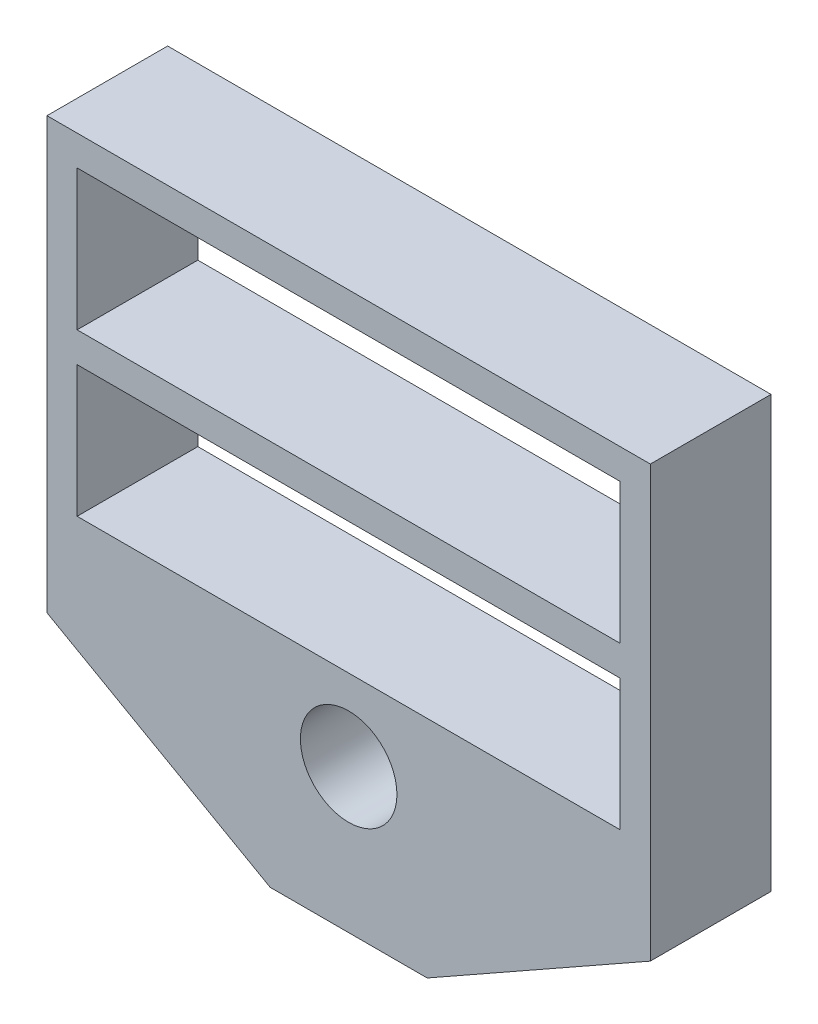
ISO-10303-21;
HEADER;
FILE_DESCRIPTION(('STEP AP214'),'2;1');
FILE_NAME('part.step','',(''),(''),'','','');
FILE_SCHEMA(('AUTOMOTIVE_DESIGN { 1 0 10303 214 1 1 1 1 }'));
ENDSEC;
DATA;
#1=APPLICATION_CONTEXT('core data for automotive mechanical design processes');
#2=APPLICATION_PROTOCOL_DEFINITION('international standard','automotive_design',2000,#1);
#3=PRODUCT_CONTEXT('',#1,'mechanical');
#4=PRODUCT('Part','Part','',(#3));
#5=PRODUCT_RELATED_PRODUCT_CATEGORY('part','',(#4));
#6=PRODUCT_DEFINITION_FORMATION('','',#4);
#7=PRODUCT_DEFINITION_CONTEXT('part definition',#1,'design');
#8=PRODUCT_DEFINITION('design','',#6,#7);
#9=PRODUCT_DEFINITION_SHAPE('','',#8);
#10=(LENGTH_UNIT() NAMED_UNIT(*) SI_UNIT(.MILLI.,.METRE.));
#11=(NAMED_UNIT(*) PLANE_ANGLE_UNIT() SI_UNIT($,.RADIAN.));
#12=(NAMED_UNIT(*) SI_UNIT($,.STERADIAN.) SOLID_ANGLE_UNIT());
#13=UNCERTAINTY_MEASURE_WITH_UNIT(LENGTH_MEASURE(1.E-05),#10,'distance_accuracy_value','');
#14=(GEOMETRIC_REPRESENTATION_CONTEXT(3) GLOBAL_UNCERTAINTY_ASSIGNED_CONTEXT((#13)) GLOBAL_UNIT_ASSIGNED_CONTEXT((#10,
#11,#12)) REPRESENTATION_CONTEXT('',''));
#15=CARTESIAN_POINT('',(0.,0.,0.));
#16=DIRECTION('',(0.,0.,1.));
#17=DIRECTION('',(1.,0.,0.));
#18=AXIS2_PLACEMENT_3D('',#15,#16,#17);
#19=CARTESIAN_POINT('',(-45.,0.,-10.));
#20=DIRECTION('',(1.,0.,0.));
#21=DIRECTION('',(0.,0.,-1.));
#22=AXIS2_PLACEMENT_3D('',#19,#20,#21);
#23=PLANE('',#22);
#24=DIRECTION('',(0.,1.,0.));
#25=VECTOR('',#24,1.);
#26=CARTESIAN_POINT('',(-45.,0.,-10.));
#27=LINE('',#26,#25);
#28=CARTESIAN_POINT('',(-45.,13.4322142937052,-10.));
#29=VERTEX_POINT('',#28);
#30=CARTESIAN_POINT('',(-45.,35.1948730291194,-10.));
#31=VERTEX_POINT('',#30);
#32=EDGE_CURVE('E121',#29,#31,#27,.T.);
#33=ORIENTED_EDGE('',*,*,#32,.T.);
#34=DIRECTION('',(0.,0.,-1.));
#35=VECTOR('',#34,1.);
#36=CARTESIAN_POINT('',(-45.,35.1948730291194,0.));
#37=LINE('',#36,#35);
#38=CARTESIAN_POINT('',(-45.,35.1948730291194,10.));
#39=VERTEX_POINT('',#38);
#40=EDGE_CURVE('E209',#39,#31,#37,.T.);
#41=ORIENTED_EDGE('',*,*,#40,.F.);
#42=DIRECTION('',(0.,1.,0.));
#43=VECTOR('',#42,1.);
#44=CARTESIAN_POINT('',(-45.,0.,10.));
#45=LINE('',#44,#43);
#46=CARTESIAN_POINT('',(-45.,13.4322142937052,10.));
#47=VERTEX_POINT('',#46);
#48=EDGE_CURVE('E364',#47,#39,#45,.T.);
#49=ORIENTED_EDGE('',*,*,#48,.F.);
#50=DIRECTION('',(0.,0.,1.));
#51=VECTOR('',#50,1.);
#52=CARTESIAN_POINT('',(-45.,13.4322142937052,-10.));
#53=LINE('',#52,#51);
#54=EDGE_CURVE('E246',#29,#47,#53,.T.);
#55=ORIENTED_EDGE('',*,*,#54,.F.);
#56=EDGE_LOOP('',(#33,#41,#49,#55));
#57=FACE_BOUND('',#56,.T.);
#58=ADVANCED_FACE('F97',(#57),#23,.T.);
#59=CARTESIAN_POINT('',(45.,0.,-10.));
#60=DIRECTION('',(1.,0.,0.));
#61=DIRECTION('',(0.,0.,-1.));
#62=AXIS2_PLACEMENT_3D('',#59,#60,#61);
#63=PLANE('',#62);
#64=DIRECTION('',(0.,0.,1.));
#65=VECTOR('',#64,1.);
#66=CARTESIAN_POINT('',(45.,35.1948730291194,0.));
#67=LINE('',#66,#65);
#68=CARTESIAN_POINT('',(45.,35.1948730291194,-10.));
#69=VERTEX_POINT('',#68);
#70=CARTESIAN_POINT('',(45.,35.1948730291194,10.));
#71=VERTEX_POINT('',#70);
#72=EDGE_CURVE('E220',#69,#71,#67,.T.);
#73=ORIENTED_EDGE('',*,*,#72,.F.);
#74=DIRECTION('',(0.,1.,0.));
#75=VECTOR('',#74,1.);
#76=CARTESIAN_POINT('',(45.,0.,-10.));
#77=LINE('',#76,#75);
#78=CARTESIAN_POINT('',(45.,13.4322142937052,-10.));
#79=VERTEX_POINT('',#78);
#80=EDGE_CURVE('E227',#79,#69,#77,.T.);
#81=ORIENTED_EDGE('',*,*,#80,.F.);
#82=DIRECTION('',(0.,0.,1.));
#83=VECTOR('',#82,1.);
#84=CARTESIAN_POINT('',(45.,13.4322142937052,-10.));
#85=LINE('',#84,#83);
#86=CARTESIAN_POINT('',(45.,13.4322142937052,10.));
#87=VERTEX_POINT('',#86);
#88=EDGE_CURVE('E233',#79,#87,#85,.T.);
#89=ORIENTED_EDGE('',*,*,#88,.T.);
#90=DIRECTION('',(0.,1.,0.));
#91=VECTOR('',#90,1.);
#92=CARTESIAN_POINT('',(45.,0.,10.));
#93=LINE('',#92,#91);
#94=EDGE_CURVE('E351',#87,#71,#93,.T.);
#95=ORIENTED_EDGE('',*,*,#94,.T.);
#96=EDGE_LOOP('',(#73,#81,#89,#95));
#97=FACE_BOUND('',#96,.T.);
#98=ADVANCED_FACE('F395',(#97),#63,.F.);
#99=CARTESIAN_POINT('',(0.,13.4322142937052,10.));
#100=DIRECTION('',(0.,-1.,0.));
#101=DIRECTION('',(0.,0.,-1.));
#102=AXIS2_PLACEMENT_3D('',#99,#100,#101);
#103=PLANE('',#102);
#104=DIRECTION('',(-1.,0.,0.));
#105=VECTOR('',#104,1.);
#106=CARTESIAN_POINT('',(0.,13.4322142937052,-10.));
#107=LINE('',#106,#105);
#108=EDGE_CURVE('E265',#79,#29,#107,.T.);
#109=ORIENTED_EDGE('',*,*,#108,.T.);
#110=ORIENTED_EDGE('',*,*,#54,.T.);
#111=DIRECTION('',(-1.,0.,0.));
#112=VECTOR('',#111,1.);
#113=CARTESIAN_POINT('',(0.,13.4322142937052,10.));
#114=LINE('',#113,#112);
#115=EDGE_CURVE('E291',#87,#47,#114,.T.);
#116=ORIENTED_EDGE('',*,*,#115,.F.);
#117=ORIENTED_EDGE('',*,*,#88,.F.);
#118=EDGE_LOOP('',(#109,#110,#116,#117));
#119=FACE_BOUND('',#118,.T.);
#120=ADVANCED_FACE('F391',(#119),#103,.F.);
#121=CARTESIAN_POINT('',(50.,0.,10.));
#122=DIRECTION('',(1.,0.,0.));
#123=DIRECTION('',(0.,1.,0.));
#124=AXIS2_PLACEMENT_3D('',#121,#122,#123);
#125=PLANE('',#124);
#126=DIRECTION('',(0.,-1.,0.));
#127=VECTOR('',#126,1.);
#128=CARTESIAN_POINT('',(50.,0.,10.));
#129=LINE('',#128,#127);
#130=CARTESIAN_POINT('',(50.,68.4322142937052,10.));
#131=VERTEX_POINT('',#130);
#132=CARTESIAN_POINT('',(50.,-2.91671614465819,10.));
#133=VERTEX_POINT('',#132);
#134=EDGE_CURVE('E288',#131,#133,#129,.T.);
#135=ORIENTED_EDGE('',*,*,#134,.T.);
#136=DIRECTION('',(0.,0.,-1.));
#137=VECTOR('',#136,1.);
#138=CARTESIAN_POINT('',(50.,-2.91671614465819,10.));
#139=LINE('',#138,#137);
#140=CARTESIAN_POINT('',(50.,-2.91671614465819,-10.));
#141=VERTEX_POINT('',#140);
#142=EDGE_CURVE('E312',#133,#141,#139,.T.);
#143=ORIENTED_EDGE('',*,*,#142,.T.);
#144=DIRECTION('',(0.,-1.,0.));
#145=VECTOR('',#144,1.);
#146=CARTESIAN_POINT('',(50.,0.,-10.));
#147=LINE('',#146,#145);
#148=CARTESIAN_POINT('',(50.,68.4322142937052,-10.));
#149=VERTEX_POINT('',#148);
#150=EDGE_CURVE('E262',#149,#141,#147,.T.);
#151=ORIENTED_EDGE('',*,*,#150,.F.);
#152=DIRECTION('',(0.,0.,1.));
#153=VECTOR('',#152,1.);
#154=CARTESIAN_POINT('',(50.,68.4322142937052,-10.));
#155=LINE('',#154,#153);
#156=EDGE_CURVE('E254',#149,#131,#155,.T.);
#157=ORIENTED_EDGE('',*,*,#156,.T.);
#158=EDGE_LOOP('',(#135,#143,#151,#157));
#159=FACE_BOUND('',#158,.T.);
#160=ADVANCED_FACE('F99',(#159),#125,.T.);
#161=CARTESIAN_POINT('',(-50.,0.,10.));
#162=DIRECTION('',(1.,0.,0.));
#163=DIRECTION('',(0.,1.,0.));
#164=AXIS2_PLACEMENT_3D('',#161,#162,#163);
#165=PLANE('',#164);
#166=DIRECTION('',(0.,-1.,0.));
#167=VECTOR('',#166,1.);
#168=CARTESIAN_POINT('',(-50.,0.,-10.));
#169=LINE('',#168,#167);
#170=CARTESIAN_POINT('',(-50.,68.4322142937052,-10.));
#171=VERTEX_POINT('',#170);
#172=CARTESIAN_POINT('',(-50.,-2.9167161446582,-10.));
#173=VERTEX_POINT('',#172);
#174=EDGE_CURVE('E269',#171,#173,#169,.T.);
#175=ORIENTED_EDGE('',*,*,#174,.T.);
#176=DIRECTION('',(0.,0.,-1.));
#177=VECTOR('',#176,1.);
#178=CARTESIAN_POINT('',(-50.,-2.9167161446582,10.));
#179=LINE('',#178,#177);
#180=CARTESIAN_POINT('',(-50.,-2.9167161446582,10.));
#181=VERTEX_POINT('',#180);
#182=EDGE_CURVE('E12',#181,#173,#179,.T.);
#183=ORIENTED_EDGE('',*,*,#182,.F.);
#184=DIRECTION('',(0.,-1.,0.));
#185=VECTOR('',#184,1.);
#186=CARTESIAN_POINT('',(-50.,0.,10.));
#187=LINE('',#186,#185);
#188=CARTESIAN_POINT('',(-50.,68.4322142937052,10.));
#189=VERTEX_POINT('',#188);
#190=EDGE_CURVE('E295',#189,#181,#187,.T.);
#191=ORIENTED_EDGE('',*,*,#190,.F.);
#192=DIRECTION('',(0.,0.,1.));
#193=VECTOR('',#192,1.);
#194=CARTESIAN_POINT('',(-50.,68.4322142937052,-10.));
#195=LINE('',#194,#193);
#196=EDGE_CURVE('E258',#171,#189,#195,.T.);
#197=ORIENTED_EDGE('',*,*,#196,.F.);
#198=EDGE_LOOP('',(#175,#183,#191,#197));
#199=FACE_BOUND('',#198,.T.);
#200=ADVANCED_FACE('F333',(#199),#165,.F.);
#201=CARTESIAN_POINT('',(-13.3634834694245,-23.6330799713918,10.));
#202=DIRECTION('',(0.492215125545242,0.870473589596193,0.));
#203=DIRECTION('',(-0.870473589596193,0.492215125545242,0.));
#204=AXIS2_PLACEMENT_3D('',#201,#202,#203);
#205=PLANE('',#204);
#206=ORIENTED_EDGE('',*,*,#182,.T.);
#207=DIRECTION('',(0.870473589596193,-0.492215125545242,0.));
#208=VECTOR('',#207,1.);
#209=CARTESIAN_POINT('',(-13.3634834694245,-23.6330799713918,-10.));
#210=LINE('',#209,#208);
#211=CARTESIAN_POINT('',(-13.0139644497253,-23.8307178437154,-10.));
#212=VERTEX_POINT('',#211);
#213=EDGE_CURVE('E272',#173,#212,#210,.T.);
#214=ORIENTED_EDGE('',*,*,#213,.T.);
#215=DIRECTION('',(0.,0.,-1.));
#216=VECTOR('',#215,1.);
#217=CARTESIAN_POINT('',(-13.0139644497253,-23.8307178437154,10.));
#218=LINE('',#217,#216);
#219=CARTESIAN_POINT('',(-13.0139644497253,-23.8307178437154,10.));
#220=VERTEX_POINT('',#219);
#221=EDGE_CURVE('E106',#220,#212,#218,.T.);
#222=ORIENTED_EDGE('',*,*,#221,.F.);
#223=DIRECTION('',(0.870473589596193,-0.492215125545242,0.));
#224=VECTOR('',#223,1.);
#225=CARTESIAN_POINT('',(-13.3634834694245,-23.6330799713918,10.));
#226=LINE('',#225,#224);
#227=EDGE_CURVE('E298',#181,#220,#226,.T.);
#228=ORIENTED_EDGE('',*,*,#227,.F.);
#229=EDGE_LOOP('',(#206,#214,#222,#228));
#230=FACE_BOUND('',#229,.T.);
#231=ADVANCED_FACE('F330',(#230),#205,.F.);
#232=CARTESIAN_POINT('',(0.,-23.8307178437154,10.));
#233=DIRECTION('',(0.,1.,0.));
#234=DIRECTION('',(0.,0.,1.));
#235=AXIS2_PLACEMENT_3D('',#232,#233,#234);
#236=PLANE('',#235);
#237=ORIENTED_EDGE('',*,*,#221,.T.);
#238=DIRECTION('',(1.,0.,0.));
#239=VECTOR('',#238,1.);
#240=CARTESIAN_POINT('',(0.,-23.8307178437154,-10.));
#241=LINE('',#240,#239);
#242=CARTESIAN_POINT('',(13.0139644497255,-23.8307178437154,-10.));
#243=VERTEX_POINT('',#242);
#244=EDGE_CURVE('E276',#212,#243,#241,.T.);
#245=ORIENTED_EDGE('',*,*,#244,.T.);
#246=DIRECTION('',(0.,0.,-1.));
#247=VECTOR('',#246,1.);
#248=CARTESIAN_POINT('',(13.0139644497255,-23.8307178437154,10.));
#249=LINE('',#248,#247);
#250=CARTESIAN_POINT('',(13.0139644497255,-23.8307178437154,10.));
#251=VERTEX_POINT('',#250);
#252=EDGE_CURVE('E316',#251,#243,#249,.T.);
#253=ORIENTED_EDGE('',*,*,#252,.F.);
#254=DIRECTION('',(1.,0.,0.));
#255=VECTOR('',#254,1.);
#256=CARTESIAN_POINT('',(0.,-23.8307178437154,10.));
#257=LINE('',#256,#255);
#258=EDGE_CURVE('E301',#220,#251,#257,.T.);
#259=ORIENTED_EDGE('',*,*,#258,.F.);
#260=EDGE_LOOP('',(#237,#245,#253,#259));
#261=FACE_BOUND('',#260,.T.);
#262=ADVANCED_FACE('F323',(#261),#236,.F.);
#263=CARTESIAN_POINT('',(13.3634834694246,-23.6330799713918,10.));
#264=DIRECTION('',(0.492215125545244,-0.870473589596192,0.));
#265=DIRECTION('',(0.870473589596192,0.492215125545244,0.));
#266=AXIS2_PLACEMENT_3D('',#263,#264,#265);
#267=PLANE('',#266);
#268=ORIENTED_EDGE('',*,*,#252,.T.);
#269=DIRECTION('',(-0.870473589596192,-0.492215125545244,0.));
#270=VECTOR('',#269,1.);
#271=CARTESIAN_POINT('',(13.3634834694246,-23.6330799713918,-10.));
#272=LINE('',#271,#270);
#273=EDGE_CURVE('E280',#141,#243,#272,.T.);
#274=ORIENTED_EDGE('',*,*,#273,.F.);
#275=ORIENTED_EDGE('',*,*,#142,.F.);
#276=DIRECTION('',(-0.870473589596192,-0.492215125545244,0.));
#277=VECTOR('',#276,1.);
#278=CARTESIAN_POINT('',(13.3634834694246,-23.6330799713918,10.));
#279=LINE('',#278,#277);
#280=EDGE_CURVE('E304',#133,#251,#279,.T.);
#281=ORIENTED_EDGE('',*,*,#280,.T.);
#282=EDGE_LOOP('',(#268,#274,#275,#281));
#283=FACE_BOUND('',#282,.T.);
#284=ADVANCED_FACE('F346',(#283),#267,.T.);
#285=CARTESIAN_POINT('',(0.,0.,10.));
#286=DIRECTION('',(0.,0.,-1.));
#287=DIRECTION('',(-1.,0.,0.));
#288=AXIS2_PLACEMENT_3D('',#285,#286,#287);
#289=CYLINDRICAL_SURFACE('',#288,8.);
#290=CARTESIAN_POINT('',(0.,0.,10.));
#291=DIRECTION('',(0.,0.,1.));
#292=DIRECTION('',(1.,0.,0.));
#293=AXIS2_PLACEMENT_3D('',#290,#291,#292);
#294=CIRCLE('',#293,8.);
#295=CARTESIAN_POINT('',(8.,0.,10.));
#296=VERTEX_POINT('',#295);
#297=EDGE_CURVE('E308',#296,#296,#294,.T.);
#298=ORIENTED_EDGE('',*,*,#297,.T.);
#299=EDGE_LOOP('',(#298));
#300=FACE_BOUND('',#299,.T.);
#301=CARTESIAN_POINT('',(0.,0.,-10.));
#302=DIRECTION('',(0.,0.,1.));
#303=DIRECTION('',(1.,0.,0.));
#304=AXIS2_PLACEMENT_3D('',#301,#302,#303);
#305=CIRCLE('',#304,8.);
#306=CARTESIAN_POINT('',(8.,0.,-10.));
#307=VERTEX_POINT('',#306);
#308=EDGE_CURVE('E284',#307,#307,#305,.T.);
#309=ORIENTED_EDGE('',*,*,#308,.F.);
#310=EDGE_LOOP('',(#309));
#311=FACE_BOUND('',#310,.T.);
#312=ADVANCED_FACE('F424',(#300,#311),#289,.F.);
#313=CARTESIAN_POINT('',(0.,0.,10.));
#314=DIRECTION('',(0.,0.,1.));
#315=DIRECTION('',(1.,0.,0.));
#316=AXIS2_PLACEMENT_3D('',#313,#314,#315);
#317=PLANE('',#316);
#318=ORIENTED_EDGE('',*,*,#48,.T.);
#319=DIRECTION('',(1.,0.,0.));
#320=VECTOR('',#319,1.);
#321=CARTESIAN_POINT('',(-65.6155281280883,35.1948730291194,10.));
#322=LINE('',#321,#320);
#323=EDGE_CURVE('E371',#39,#71,#322,.T.);
#324=ORIENTED_EDGE('',*,*,#323,.T.);
#325=ORIENTED_EDGE('',*,*,#94,.F.);
#326=ORIENTED_EDGE('',*,*,#115,.T.);
#327=EDGE_LOOP('',(#318,#324,#325,#326));
#328=FACE_BOUND('',#327,.T.);
#329=DIRECTION('',(1.,0.,0.));
#330=VECTOR('',#329,1.);
#331=CARTESIAN_POINT('',(0.,68.4322142937052,10.));
#332=LINE('',#331,#330);
#333=EDGE_CURVE('E341',#189,#131,#332,.T.);
#334=ORIENTED_EDGE('',*,*,#333,.F.);
#335=ORIENTED_EDGE('',*,*,#190,.T.);
#336=ORIENTED_EDGE('',*,*,#227,.T.);
#337=ORIENTED_EDGE('',*,*,#258,.T.);
#338=ORIENTED_EDGE('',*,*,#280,.F.);
#339=ORIENTED_EDGE('',*,*,#134,.F.);
#340=EDGE_LOOP('',(#334,#335,#336,#337,#338,#339));
#341=FACE_BOUND('',#340,.T.);
#342=DIRECTION('',(1.,0.,0.));
#343=VECTOR('',#342,1.);
#344=CARTESIAN_POINT('',(-65.6155281280883,40.1948730291195,10.));
#345=LINE('',#344,#343);
#346=CARTESIAN_POINT('',(-45.,40.1948730291195,10.));
#347=VERTEX_POINT('',#346);
#348=CARTESIAN_POINT('',(45.,40.1948730291195,10.));
#349=VERTEX_POINT('',#348);
#350=EDGE_CURVE('E216',#347,#349,#345,.T.);
#351=ORIENTED_EDGE('',*,*,#350,.F.);
#352=CARTESIAN_POINT('',(-45.,63.4322142937052,10.));
#353=VERTEX_POINT('',#352);
#354=EDGE_CURVE('E367',#347,#353,#45,.T.);
#355=ORIENTED_EDGE('',*,*,#354,.T.);
#356=DIRECTION('',(1.,0.,0.));
#357=VECTOR('',#356,1.);
#358=CARTESIAN_POINT('',(0.,63.4322142937052,10.));
#359=LINE('',#358,#357);
#360=CARTESIAN_POINT('',(45.,63.4322142937052,10.));
#361=VERTEX_POINT('',#360);
#362=EDGE_CURVE('E360',#353,#361,#359,.T.);
#363=ORIENTED_EDGE('',*,*,#362,.T.);
#364=EDGE_CURVE('E356',#349,#361,#93,.T.);
#365=ORIENTED_EDGE('',*,*,#364,.F.);
#366=EDGE_LOOP('',(#351,#355,#363,#365));
#367=FACE_BOUND('',#366,.T.);
#368=ORIENTED_EDGE('',*,*,#297,.F.);
#369=EDGE_LOOP('',(#368));
#370=FACE_BOUND('',#369,.T.);
#371=ADVANCED_FACE('F348',(#328,#341,#367,#370),#317,.T.);
#372=CARTESIAN_POINT('',(0.,0.,-10.));
#373=DIRECTION('',(0.,0.,1.));
#374=DIRECTION('',(1.,0.,0.));
#375=AXIS2_PLACEMENT_3D('',#372,#373,#374);
#376=PLANE('',#375);
#377=CARTESIAN_POINT('',(-45.,40.1948730291195,-10.));
#378=VERTEX_POINT('',#377);
#379=CARTESIAN_POINT('',(-45.,63.4322142937052,-10.));
#380=VERTEX_POINT('',#379);
#381=EDGE_CURVE('E206',#378,#380,#27,.T.);
#382=ORIENTED_EDGE('',*,*,#381,.F.);
#383=DIRECTION('',(1.,0.,0.));
#384=VECTOR('',#383,1.);
#385=CARTESIAN_POINT('',(-65.6155281280883,40.1948730291195,-10.));
#386=LINE('',#385,#384);
#387=CARTESIAN_POINT('',(45.,40.1948730291195,-10.));
#388=VERTEX_POINT('',#387);
#389=EDGE_CURVE('E198',#378,#388,#386,.T.);
#390=ORIENTED_EDGE('',*,*,#389,.T.);
#391=CARTESIAN_POINT('',(45.,63.4322142937052,-10.));
#392=VERTEX_POINT('',#391);
#393=EDGE_CURVE('E204',#388,#392,#77,.T.);
#394=ORIENTED_EDGE('',*,*,#393,.T.);
#395=DIRECTION('',(1.,0.,0.));
#396=VECTOR('',#395,1.);
#397=CARTESIAN_POINT('',(0.,63.4322142937052,-10.));
#398=LINE('',#397,#396);
#399=EDGE_CURVE('E228',#380,#392,#398,.T.);
#400=ORIENTED_EDGE('',*,*,#399,.F.);
#401=EDGE_LOOP('',(#382,#390,#394,#400));
#402=FACE_BOUND('',#401,.T.);
#403=ORIENTED_EDGE('',*,*,#174,.F.);
#404=DIRECTION('',(1.,0.,0.));
#405=VECTOR('',#404,1.);
#406=CARTESIAN_POINT('',(0.,68.4322142937052,-10.));
#407=LINE('',#406,#405);
#408=EDGE_CURVE('E250',#171,#149,#407,.T.);
#409=ORIENTED_EDGE('',*,*,#408,.T.);
#410=ORIENTED_EDGE('',*,*,#150,.T.);
#411=ORIENTED_EDGE('',*,*,#273,.T.);
#412=ORIENTED_EDGE('',*,*,#244,.F.);
#413=ORIENTED_EDGE('',*,*,#213,.F.);
#414=EDGE_LOOP('',(#403,#409,#410,#411,#412,#413));
#415=FACE_BOUND('',#414,.T.);
#416=ORIENTED_EDGE('',*,*,#32,.F.);
#417=ORIENTED_EDGE('',*,*,#108,.F.);
#418=ORIENTED_EDGE('',*,*,#80,.T.);
#419=DIRECTION('',(1.,0.,0.));
#420=VECTOR('',#419,1.);
#421=CARTESIAN_POINT('',(-65.6155281280883,35.1948730291194,-10.));
#422=LINE('',#421,#420);
#423=EDGE_CURVE('E210',#31,#69,#422,.T.);
#424=ORIENTED_EDGE('',*,*,#423,.F.);
#425=EDGE_LOOP('',(#416,#417,#418,#424));
#426=FACE_BOUND('',#425,.T.);
#427=ORIENTED_EDGE('',*,*,#308,.T.);
#428=EDGE_LOOP('',(#427));
#429=FACE_BOUND('',#428,.T.);
#430=ADVANCED_FACE('F200',(#402,#415,#426,#429),#376,.F.);
#431=CARTESIAN_POINT('',(0.,68.4322142937052,-10.));
#432=DIRECTION('',(0.,-1.,0.));
#433=DIRECTION('',(0.,0.,-1.));
#434=AXIS2_PLACEMENT_3D('',#431,#432,#433);
#435=PLANE('',#434);
#436=ORIENTED_EDGE('',*,*,#196,.T.);
#437=ORIENTED_EDGE('',*,*,#333,.T.);
#438=ORIENTED_EDGE('',*,*,#156,.F.);
#439=ORIENTED_EDGE('',*,*,#408,.F.);
#440=EDGE_LOOP('',(#436,#437,#438,#439));
#441=FACE_BOUND('',#440,.T.);
#442=ADVANCED_FACE('F339',(#441),#435,.F.);
#443=DIRECTION('',(0.,0.,-1.));
#444=VECTOR('',#443,1.);
#445=CARTESIAN_POINT('',(-45.,40.1948730291195,0.));
#446=LINE('',#445,#444);
#447=EDGE_CURVE('E113',#347,#378,#446,.T.);
#448=ORIENTED_EDGE('',*,*,#447,.T.);
#449=ORIENTED_EDGE('',*,*,#381,.T.);
#450=DIRECTION('',(0.,0.,1.));
#451=VECTOR('',#450,1.);
#452=CARTESIAN_POINT('',(-45.,63.4322142937052,-10.));
#453=LINE('',#452,#451);
#454=EDGE_CURVE('E242',#380,#353,#453,.T.);
#455=ORIENTED_EDGE('',*,*,#454,.T.);
#456=ORIENTED_EDGE('',*,*,#354,.F.);
#457=EDGE_LOOP('',(#448,#449,#455,#456));
#458=FACE_BOUND('',#457,.T.);
#459=ADVANCED_FACE('F404',(#458),#23,.T.);
#460=CARTESIAN_POINT('',(0.,63.4322142937052,-10.));
#461=DIRECTION('',(0.,-1.,0.));
#462=DIRECTION('',(0.,0.,-1.));
#463=AXIS2_PLACEMENT_3D('',#460,#461,#462);
#464=PLANE('',#463);
#465=DIRECTION('',(0.,0.,1.));
#466=VECTOR('',#465,1.);
#467=CARTESIAN_POINT('',(45.,63.4322142937052,-10.));
#468=LINE('',#467,#466);
#469=EDGE_CURVE('E224',#392,#361,#468,.T.);
#470=ORIENTED_EDGE('',*,*,#469,.T.);
#471=ORIENTED_EDGE('',*,*,#362,.F.);
#472=ORIENTED_EDGE('',*,*,#454,.F.);
#473=ORIENTED_EDGE('',*,*,#399,.T.);
#474=EDGE_LOOP('',(#470,#471,#472,#473));
#475=FACE_BOUND('',#474,.T.);
#476=ADVANCED_FACE('F408',(#475),#464,.T.);
#477=ORIENTED_EDGE('',*,*,#393,.F.);
#478=DIRECTION('',(0.,0.,1.));
#479=VECTOR('',#478,1.);
#480=CARTESIAN_POINT('',(45.,40.1948730291195,0.));
#481=LINE('',#480,#479);
#482=EDGE_CURVE('E213',#388,#349,#481,.T.);
#483=ORIENTED_EDGE('',*,*,#482,.T.);
#484=ORIENTED_EDGE('',*,*,#364,.T.);
#485=ORIENTED_EDGE('',*,*,#469,.F.);
#486=EDGE_LOOP('',(#477,#483,#484,#485));
#487=FACE_BOUND('',#486,.T.);
#488=ADVANCED_FACE('F222',(#487),#63,.F.);
#489=CARTESIAN_POINT('',(-65.6155281280883,35.1948730291194,0.));
#490=DIRECTION('',(0.,1.,0.));
#491=DIRECTION('',(0.,0.,1.));
#492=AXIS2_PLACEMENT_3D('',#489,#490,#491);
#493=PLANE('',#492);
#494=ORIENTED_EDGE('',*,*,#323,.F.);
#495=ORIENTED_EDGE('',*,*,#40,.T.);
#496=ORIENTED_EDGE('',*,*,#423,.T.);
#497=ORIENTED_EDGE('',*,*,#72,.T.);
#498=EDGE_LOOP('',(#494,#495,#496,#497));
#499=FACE_BOUND('',#498,.T.);
#500=ADVANCED_FACE('F385',(#499),#493,.F.);
#501=CARTESIAN_POINT('',(-65.6155281280883,40.1948730291195,0.));
#502=DIRECTION('',(0.,1.,0.));
#503=DIRECTION('',(0.,0.,1.));
#504=AXIS2_PLACEMENT_3D('',#501,#502,#503);
#505=PLANE('',#504);
#506=ORIENTED_EDGE('',*,*,#447,.F.);
#507=ORIENTED_EDGE('',*,*,#350,.T.);
#508=ORIENTED_EDGE('',*,*,#482,.F.);
#509=ORIENTED_EDGE('',*,*,#389,.F.);
#510=EDGE_LOOP('',(#506,#507,#508,#509));
#511=FACE_BOUND('',#510,.T.);
#512=ADVANCED_FACE('F214',(#511),#505,.T.);
#513=CLOSED_SHELL('',(#58,#98,#120,#160,#200,#231,#262,#284,#312,#371,#430,#442,#459,#476,#488,
#500,#512));
#514=MANIFOLD_SOLID_BREP('B2',#513);
#515=ADVANCED_BREP_SHAPE_REPRESENTATION('',(#18,#514),#14);
#516=SHAPE_DEFINITION_REPRESENTATION(#9,#515);
ENDSEC;
END-ISO-10303-21;
